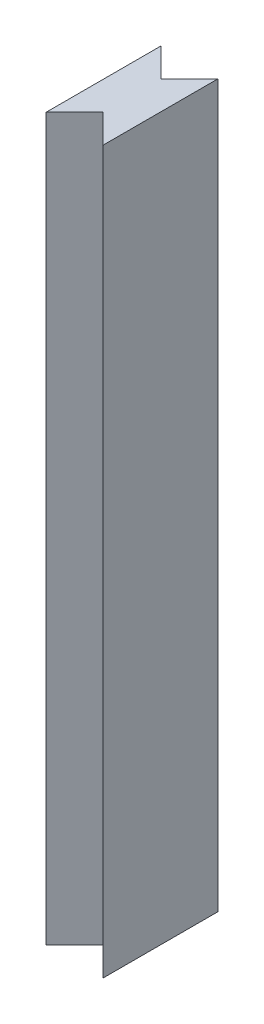
ISO-10303-21;
HEADER;
FILE_DESCRIPTION(('STEP AP214'),'2;1');
FILE_NAME('part.step','',(''),(''),'','','');
FILE_SCHEMA(('AUTOMOTIVE_DESIGN { 1 0 10303 214 1 1 1 1 }'));
ENDSEC;
DATA;
#1=APPLICATION_CONTEXT('core data for automotive mechanical design processes');
#2=APPLICATION_PROTOCOL_DEFINITION('international standard','automotive_design',2000,#1);
#3=PRODUCT_CONTEXT('',#1,'mechanical');
#4=PRODUCT('Part','Part','',(#3));
#5=PRODUCT_RELATED_PRODUCT_CATEGORY('part','',(#4));
#6=PRODUCT_DEFINITION_FORMATION('','',#4);
#7=PRODUCT_DEFINITION_CONTEXT('part definition',#1,'design');
#8=PRODUCT_DEFINITION('design','',#6,#7);
#9=PRODUCT_DEFINITION_SHAPE('','',#8);
#10=(LENGTH_UNIT() NAMED_UNIT(*) SI_UNIT(.MILLI.,.METRE.));
#11=(NAMED_UNIT(*) PLANE_ANGLE_UNIT() SI_UNIT($,.RADIAN.));
#12=(NAMED_UNIT(*) SI_UNIT($,.STERADIAN.) SOLID_ANGLE_UNIT());
#13=UNCERTAINTY_MEASURE_WITH_UNIT(LENGTH_MEASURE(1.E-05),#10,'distance_accuracy_value','');
#14=(GEOMETRIC_REPRESENTATION_CONTEXT(3) GLOBAL_UNCERTAINTY_ASSIGNED_CONTEXT((#13)) GLOBAL_UNIT_ASSIGNED_CONTEXT((#10,
#11,#12)) REPRESENTATION_CONTEXT('',''));
#15=CARTESIAN_POINT('',(0.,0.,0.));
#16=DIRECTION('',(0.,0.,1.));
#17=DIRECTION('',(1.,0.,0.));
#18=AXIS2_PLACEMENT_3D('',#15,#16,#17);
#19=CARTESIAN_POINT('',(1.975,50.,-3.97499999999997));
#20=DIRECTION('',(-1.,0.,0.));
#21=DIRECTION('',(0.,0.,1.));
#22=AXIS2_PLACEMENT_3D('',#19,#20,#21);
#23=PLANE('',#22);
#24=DIRECTION('',(0.,0.,-1.));
#25=VECTOR('',#24,1.);
#26=CARTESIAN_POINT('',(1.975,0.,-3.97499999999997));
#27=LINE('',#26,#25);
#28=CARTESIAN_POINT('',(1.975,0.,3.97500000000003));
#29=VERTEX_POINT('',#28);
#30=CARTESIAN_POINT('',(1.975,0.,-3.97499999999997));
#31=VERTEX_POINT('',#30);
#32=EDGE_CURVE('E117',#29,#31,#27,.T.);
#33=ORIENTED_EDGE('',*,*,#32,.T.);
#34=DIRECTION('',(0.,-1.,0.));
#35=VECTOR('',#34,1.);
#36=CARTESIAN_POINT('',(1.975,50.,-3.97499999999997));
#37=LINE('',#36,#35);
#38=CARTESIAN_POINT('',(1.975,50.,-3.97499999999997));
#39=VERTEX_POINT('',#38);
#40=EDGE_CURVE('E11',#39,#31,#37,.T.);
#41=ORIENTED_EDGE('',*,*,#40,.F.);
#42=DIRECTION('',(0.,0.,-1.));
#43=VECTOR('',#42,1.);
#44=CARTESIAN_POINT('',(1.975,50.,-3.97499999999997));
#45=LINE('',#44,#43);
#46=CARTESIAN_POINT('',(1.975,50.,3.97500000000003));
#47=VERTEX_POINT('',#46);
#48=EDGE_CURVE('E127',#47,#39,#45,.T.);
#49=ORIENTED_EDGE('',*,*,#48,.F.);
#50=DIRECTION('',(0.,-1.,0.));
#51=VECTOR('',#50,1.);
#52=CARTESIAN_POINT('',(1.975,50.,3.97500000000003));
#53=LINE('',#52,#51);
#54=EDGE_CURVE('E113',#47,#29,#53,.T.);
#55=ORIENTED_EDGE('',*,*,#54,.T.);
#56=EDGE_LOOP('',(#33,#41,#49,#55));
#57=FACE_BOUND('',#56,.T.);
#58=ADVANCED_FACE('F33',(#57),#23,.F.);
#59=CARTESIAN_POINT('',(1.975,50.,-3.97499999999997));
#60=DIRECTION('',(0.707106781186543,0.,0.707106781186552));
#61=DIRECTION('',(0.707106781186552,0.,-0.707106781186543));
#62=AXIS2_PLACEMENT_3D('',#59,#60,#61);
#63=PLANE('',#62);
#64=DIRECTION('',(-0.707106781186552,0.,0.707106781186543));
#65=VECTOR('',#64,1.);
#66=CARTESIAN_POINT('',(1.975,0.,-3.97499999999997));
#67=LINE('',#66,#65);
#68=CARTESIAN_POINT('',(0.,0.,-2.));
#69=VERTEX_POINT('',#68);
#70=EDGE_CURVE('E120',#31,#69,#67,.T.);
#71=ORIENTED_EDGE('',*,*,#70,.T.);
#72=DIRECTION('',(0.,-1.,0.));
#73=VECTOR('',#72,1.);
#74=CARTESIAN_POINT('',(0.,50.,-2.));
#75=LINE('',#74,#73);
#76=CARTESIAN_POINT('',(0.,50.,-2.));
#77=VERTEX_POINT('',#76);
#78=EDGE_CURVE('E41',#77,#69,#75,.T.);
#79=ORIENTED_EDGE('',*,*,#78,.F.);
#80=DIRECTION('',(-0.707106781186552,0.,0.707106781186543));
#81=VECTOR('',#80,1.);
#82=CARTESIAN_POINT('',(1.975,50.,-3.97499999999997));
#83=LINE('',#82,#81);
#84=EDGE_CURVE('E86',#39,#77,#83,.T.);
#85=ORIENTED_EDGE('',*,*,#84,.F.);
#86=ORIENTED_EDGE('',*,*,#40,.T.);
#87=EDGE_LOOP('',(#71,#79,#85,#86));
#88=FACE_BOUND('',#87,.T.);
#89=ADVANCED_FACE('F151',(#88),#63,.F.);
#90=CARTESIAN_POINT('',(-1.975,50.,-3.975));
#91=DIRECTION('',(-0.707106781186548,0.,0.707106781186547));
#92=DIRECTION('',(0.707106781186547,0.,0.707106781186548));
#93=AXIS2_PLACEMENT_3D('',#90,#91,#92);
#94=PLANE('',#93);
#95=DIRECTION('',(-0.707106781186547,0.,-0.707106781186548));
#96=VECTOR('',#95,1.);
#97=CARTESIAN_POINT('',(-1.975,0.,-3.975));
#98=LINE('',#97,#96);
#99=CARTESIAN_POINT('',(-1.975,0.,-3.975));
#100=VERTEX_POINT('',#99);
#101=EDGE_CURVE('E122',#69,#100,#98,.T.);
#102=ORIENTED_EDGE('',*,*,#101,.T.);
#103=DIRECTION('',(0.,-1.,0.));
#104=VECTOR('',#103,1.);
#105=CARTESIAN_POINT('',(-1.975,50.,-3.975));
#106=LINE('',#105,#104);
#107=CARTESIAN_POINT('',(-1.975,50.,-3.975));
#108=VERTEX_POINT('',#107);
#109=EDGE_CURVE('E108',#108,#100,#106,.T.);
#110=ORIENTED_EDGE('',*,*,#109,.F.);
#111=DIRECTION('',(-0.707106781186547,0.,-0.707106781186548));
#112=VECTOR('',#111,1.);
#113=CARTESIAN_POINT('',(-1.975,50.,-3.975));
#114=LINE('',#113,#112);
#115=EDGE_CURVE('E99',#77,#108,#114,.T.);
#116=ORIENTED_EDGE('',*,*,#115,.F.);
#117=ORIENTED_EDGE('',*,*,#78,.T.);
#118=EDGE_LOOP('',(#102,#110,#116,#117));
#119=FACE_BOUND('',#118,.T.);
#120=ADVANCED_FACE('F133',(#119),#94,.F.);
#121=CARTESIAN_POINT('',(-1.975,50.,3.97499999999999));
#122=DIRECTION('',(1.,0.,0.));
#123=DIRECTION('',(0.,0.,-1.));
#124=AXIS2_PLACEMENT_3D('',#121,#122,#123);
#125=PLANE('',#124);
#126=DIRECTION('',(0.,0.,1.));
#127=VECTOR('',#126,1.);
#128=CARTESIAN_POINT('',(-1.975,0.,3.97499999999999));
#129=LINE('',#128,#127);
#130=CARTESIAN_POINT('',(-1.975,0.,3.97499999999999));
#131=VERTEX_POINT('',#130);
#132=EDGE_CURVE('E107',#100,#131,#129,.T.);
#133=ORIENTED_EDGE('',*,*,#132,.T.);
#134=DIRECTION('',(0.,-1.,0.));
#135=VECTOR('',#134,1.);
#136=CARTESIAN_POINT('',(-1.975,50.,3.97499999999999));
#137=LINE('',#136,#135);
#138=CARTESIAN_POINT('',(-1.975,50.,3.97499999999999));
#139=VERTEX_POINT('',#138);
#140=EDGE_CURVE('E104',#139,#131,#137,.T.);
#141=ORIENTED_EDGE('',*,*,#140,.F.);
#142=DIRECTION('',(0.,0.,1.));
#143=VECTOR('',#142,1.);
#144=CARTESIAN_POINT('',(-1.975,50.,3.97499999999999));
#145=LINE('',#144,#143);
#146=EDGE_CURVE('E93',#108,#139,#145,.T.);
#147=ORIENTED_EDGE('',*,*,#146,.F.);
#148=ORIENTED_EDGE('',*,*,#109,.T.);
#149=EDGE_LOOP('',(#133,#141,#147,#148));
#150=FACE_BOUND('',#149,.T.);
#151=ADVANCED_FACE('F105',(#150),#125,.F.);
#152=CARTESIAN_POINT('',(0.,50.,2.));
#153=DIRECTION('',(-0.707106781186547,0.,-0.707106781186548));
#154=DIRECTION('',(-0.707106781186548,0.,0.707106781186547));
#155=AXIS2_PLACEMENT_3D('',#152,#153,#154);
#156=PLANE('',#155);
#157=DIRECTION('',(0.707106781186548,0.,-0.707106781186547));
#158=VECTOR('',#157,1.);
#159=CARTESIAN_POINT('',(0.,0.,2.));
#160=LINE('',#159,#158);
#161=CARTESIAN_POINT('',(0.,0.,2.));
#162=VERTEX_POINT('',#161);
#163=EDGE_CURVE('E72',#131,#162,#160,.T.);
#164=ORIENTED_EDGE('',*,*,#163,.T.);
#165=DIRECTION('',(0.,-1.,0.));
#166=VECTOR('',#165,1.);
#167=CARTESIAN_POINT('',(0.,50.,2.));
#168=LINE('',#167,#166);
#169=CARTESIAN_POINT('',(0.,50.,2.));
#170=VERTEX_POINT('',#169);
#171=EDGE_CURVE('E109',#170,#162,#168,.T.);
#172=ORIENTED_EDGE('',*,*,#171,.F.);
#173=DIRECTION('',(0.707106781186548,0.,-0.707106781186547));
#174=VECTOR('',#173,1.);
#175=CARTESIAN_POINT('',(0.,50.,2.));
#176=LINE('',#175,#174);
#177=EDGE_CURVE('E97',#139,#170,#176,.T.);
#178=ORIENTED_EDGE('',*,*,#177,.F.);
#179=ORIENTED_EDGE('',*,*,#140,.T.);
#180=EDGE_LOOP('',(#164,#172,#178,#179));
#181=FACE_BOUND('',#180,.T.);
#182=ADVANCED_FACE('F111',(#181),#156,.F.);
#183=CARTESIAN_POINT('',(1.975,50.,3.97500000000003));
#184=DIRECTION('',(0.707106781186553,0.,-0.707106781186542));
#185=DIRECTION('',(-0.707106781186542,0.,-0.707106781186553));
#186=AXIS2_PLACEMENT_3D('',#183,#184,#185);
#187=PLANE('',#186);
#188=DIRECTION('',(0.707106781186542,0.,0.707106781186553));
#189=VECTOR('',#188,1.);
#190=CARTESIAN_POINT('',(1.975,0.,3.97500000000003));
#191=LINE('',#190,#189);
#192=EDGE_CURVE('E78',#162,#29,#191,.T.);
#193=ORIENTED_EDGE('',*,*,#192,.T.);
#194=ORIENTED_EDGE('',*,*,#54,.F.);
#195=DIRECTION('',(0.707106781186542,0.,0.707106781186553));
#196=VECTOR('',#195,1.);
#197=CARTESIAN_POINT('',(1.975,50.,3.97500000000003));
#198=LINE('',#197,#196);
#199=EDGE_CURVE('E49',#170,#47,#198,.T.);
#200=ORIENTED_EDGE('',*,*,#199,.F.);
#201=ORIENTED_EDGE('',*,*,#171,.T.);
#202=EDGE_LOOP('',(#193,#194,#200,#201));
#203=FACE_BOUND('',#202,.T.);
#204=ADVANCED_FACE('F140',(#203),#187,.F.);
#205=CARTESIAN_POINT('',(0.,50.,0.));
#206=DIRECTION('',(0.,-1.,0.));
#207=DIRECTION('',(0.,0.,-1.));
#208=AXIS2_PLACEMENT_3D('',#205,#206,#207);
#209=PLANE('',#208);
#210=ORIENTED_EDGE('',*,*,#48,.T.);
#211=ORIENTED_EDGE('',*,*,#84,.T.);
#212=ORIENTED_EDGE('',*,*,#115,.T.);
#213=ORIENTED_EDGE('',*,*,#146,.T.);
#214=ORIENTED_EDGE('',*,*,#177,.T.);
#215=ORIENTED_EDGE('',*,*,#199,.T.);
#216=EDGE_LOOP('',(#210,#211,#212,#213,#214,#215));
#217=FACE_BOUND('',#216,.T.);
#218=ADVANCED_FACE('F95',(#217),#209,.F.);
#219=CARTESIAN_POINT('',(0.,0.,0.));
#220=DIRECTION('',(0.,-1.,0.));
#221=DIRECTION('',(0.,0.,-1.));
#222=AXIS2_PLACEMENT_3D('',#219,#220,#221);
#223=PLANE('',#222);
#224=ORIENTED_EDGE('',*,*,#32,.F.);
#225=ORIENTED_EDGE('',*,*,#192,.F.);
#226=ORIENTED_EDGE('',*,*,#163,.F.);
#227=ORIENTED_EDGE('',*,*,#132,.F.);
#228=ORIENTED_EDGE('',*,*,#101,.F.);
#229=ORIENTED_EDGE('',*,*,#70,.F.);
#230=EDGE_LOOP('',(#224,#225,#226,#227,#228,#229));
#231=FACE_BOUND('',#230,.T.);
#232=ADVANCED_FACE('F136',(#231),#223,.T.);
#233=CLOSED_SHELL('',(#58,#89,#120,#151,#182,#204,#218,#232));
#234=MANIFOLD_SOLID_BREP('B2',#233);
#235=ADVANCED_BREP_SHAPE_REPRESENTATION('',(#18,#234),#14);
#236=SHAPE_DEFINITION_REPRESENTATION(#9,#235);
ENDSEC;
END-ISO-10303-21;
